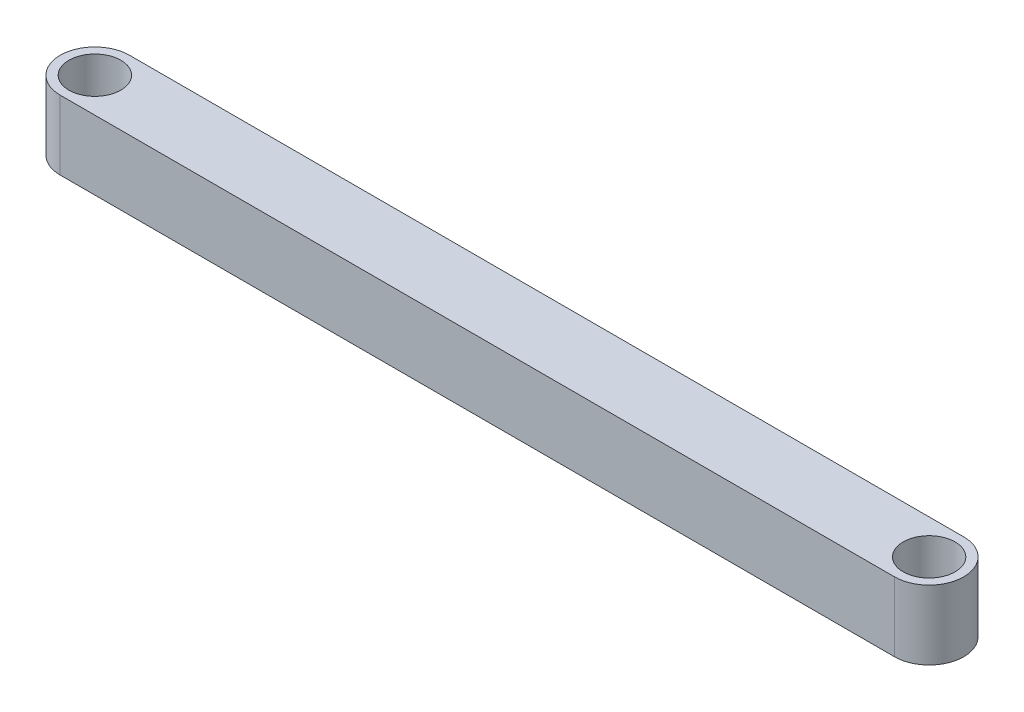
ISO-10303-21;
HEADER;
FILE_DESCRIPTION(('STEP AP214'),'2;1');
FILE_NAME('part.step','',(''),(''),'','','');
FILE_SCHEMA(('AUTOMOTIVE_DESIGN { 1 0 10303 214 1 1 1 1 }'));
ENDSEC;
DATA;
#1=APPLICATION_CONTEXT('core data for automotive mechanical design processes');
#2=APPLICATION_PROTOCOL_DEFINITION('international standard','automotive_design',2000,#1);
#3=PRODUCT_CONTEXT('',#1,'mechanical');
#4=PRODUCT('Part','Part','',(#3));
#5=PRODUCT_RELATED_PRODUCT_CATEGORY('part','',(#4));
#6=PRODUCT_DEFINITION_FORMATION('','',#4);
#7=PRODUCT_DEFINITION_CONTEXT('part definition',#1,'design');
#8=PRODUCT_DEFINITION('design','',#6,#7);
#9=PRODUCT_DEFINITION_SHAPE('','',#8);
#10=(LENGTH_UNIT() NAMED_UNIT(*) SI_UNIT(.MILLI.,.METRE.));
#11=(NAMED_UNIT(*) PLANE_ANGLE_UNIT() SI_UNIT($,.RADIAN.));
#12=(NAMED_UNIT(*) SI_UNIT($,.STERADIAN.) SOLID_ANGLE_UNIT());
#13=UNCERTAINTY_MEASURE_WITH_UNIT(LENGTH_MEASURE(1.E-05),#10,'distance_accuracy_value','');
#14=(GEOMETRIC_REPRESENTATION_CONTEXT(3) GLOBAL_UNCERTAINTY_ASSIGNED_CONTEXT((#13)) GLOBAL_UNIT_ASSIGNED_CONTEXT((#10,
#11,#12)) REPRESENTATION_CONTEXT('',''));
#15=CARTESIAN_POINT('',(0.,0.,0.));
#16=DIRECTION('',(0.,0.,1.));
#17=DIRECTION('',(1.,0.,0.));
#18=AXIS2_PLACEMENT_3D('',#15,#16,#17);
#19=CARTESIAN_POINT('',(0.,40.,0.));
#20=DIRECTION('',(0.,1.,0.));
#21=DIRECTION('',(0.,0.,1.));
#22=AXIS2_PLACEMENT_3D('',#19,#20,#21);
#23=PLANE('',#22);
#24=CARTESIAN_POINT('',(482.,40.,0.));
#25=DIRECTION('',(0.,1.,0.));
#26=DIRECTION('',(0.,0.,1.));
#27=AXIS2_PLACEMENT_3D('',#24,#25,#26);
#28=CIRCLE('',#27,15.);
#29=CARTESIAN_POINT('',(482.,40.,15.));
#30=VERTEX_POINT('',#29);
#31=EDGE_CURVE('E140',#30,#30,#28,.T.);
#32=ORIENTED_EDGE('',*,*,#31,.F.);
#33=EDGE_LOOP('',(#32));
#34=FACE_BOUND('',#33,.T.);
#35=CARTESIAN_POINT('',(0.,40.,0.));
#36=DIRECTION('',(0.,1.,0.));
#37=DIRECTION('',(0.,0.,1.));
#38=AXIS2_PLACEMENT_3D('',#35,#36,#37);
#39=CIRCLE('',#38,20.);
#40=CARTESIAN_POINT('',(0.,40.,-20.));
#41=VERTEX_POINT('',#40);
#42=CARTESIAN_POINT('',(0.,40.,20.));
#43=VERTEX_POINT('',#42);
#44=EDGE_CURVE('E124',#41,#43,#39,.T.);
#45=ORIENTED_EDGE('',*,*,#44,.T.);
#46=DIRECTION('',(1.,0.,0.));
#47=VECTOR('',#46,1.);
#48=CARTESIAN_POINT('',(0.,40.,20.));
#49=LINE('',#48,#47);
#50=CARTESIAN_POINT('',(482.,40.,20.));
#51=VERTEX_POINT('',#50);
#52=EDGE_CURVE('E117',#43,#51,#49,.T.);
#53=ORIENTED_EDGE('',*,*,#52,.T.);
#54=CARTESIAN_POINT('',(482.,40.,0.));
#55=DIRECTION('',(0.,1.,0.));
#56=DIRECTION('',(0.,0.,1.));
#57=AXIS2_PLACEMENT_3D('',#54,#55,#56);
#58=CIRCLE('',#57,20.);
#59=CARTESIAN_POINT('',(482.,40.,-20.));
#60=VERTEX_POINT('',#59);
#61=EDGE_CURVE('E123',#51,#60,#58,.T.);
#62=ORIENTED_EDGE('',*,*,#61,.T.);
#63=DIRECTION('',(1.,0.,0.));
#64=VECTOR('',#63,1.);
#65=CARTESIAN_POINT('',(0.,40.,-20.));
#66=LINE('',#65,#64);
#67=EDGE_CURVE('E133',#41,#60,#66,.T.);
#68=ORIENTED_EDGE('',*,*,#67,.F.);
#69=EDGE_LOOP('',(#45,#53,#62,#68));
#70=FACE_BOUND('',#69,.T.);
#71=CARTESIAN_POINT('',(0.,40.,0.));
#72=DIRECTION('',(0.,1.,0.));
#73=DIRECTION('',(0.,0.,1.));
#74=AXIS2_PLACEMENT_3D('',#71,#72,#73);
#75=CIRCLE('',#74,15.);
#76=CARTESIAN_POINT('',(0.,40.,15.));
#77=VERTEX_POINT('',#76);
#78=EDGE_CURVE('E153',#77,#77,#75,.T.);
#79=ORIENTED_EDGE('',*,*,#78,.F.);
#80=EDGE_LOOP('',(#79));
#81=FACE_BOUND('',#80,.T.);
#82=ADVANCED_FACE('F74',(#34,#70,#81),#23,.T.);
#83=CARTESIAN_POINT('',(0.,0.,0.));
#84=DIRECTION('',(0.,1.,0.));
#85=DIRECTION('',(0.,0.,1.));
#86=AXIS2_PLACEMENT_3D('',#83,#84,#85);
#87=PLANE('',#86);
#88=CARTESIAN_POINT('',(0.,0.,0.));
#89=DIRECTION('',(0.,1.,0.));
#90=DIRECTION('',(0.,0.,1.));
#91=AXIS2_PLACEMENT_3D('',#88,#89,#90);
#92=CIRCLE('',#91,20.);
#93=CARTESIAN_POINT('',(0.,0.,-20.));
#94=VERTEX_POINT('',#93);
#95=CARTESIAN_POINT('',(0.,0.,20.));
#96=VERTEX_POINT('',#95);
#97=EDGE_CURVE('E138',#94,#96,#92,.T.);
#98=ORIENTED_EDGE('',*,*,#97,.F.);
#99=DIRECTION('',(1.,0.,0.));
#100=VECTOR('',#99,1.);
#101=CARTESIAN_POINT('',(0.,0.,-20.));
#102=LINE('',#101,#100);
#103=CARTESIAN_POINT('',(482.,0.,-20.));
#104=VERTEX_POINT('',#103);
#105=EDGE_CURVE('E144',#94,#104,#102,.T.);
#106=ORIENTED_EDGE('',*,*,#105,.T.);
#107=CARTESIAN_POINT('',(482.,0.,0.));
#108=DIRECTION('',(0.,1.,0.));
#109=DIRECTION('',(0.,0.,1.));
#110=AXIS2_PLACEMENT_3D('',#107,#108,#109);
#111=CIRCLE('',#110,20.);
#112=CARTESIAN_POINT('',(482.,0.,20.));
#113=VERTEX_POINT('',#112);
#114=EDGE_CURVE('E142',#113,#104,#111,.T.);
#115=ORIENTED_EDGE('',*,*,#114,.F.);
#116=DIRECTION('',(1.,0.,0.));
#117=VECTOR('',#116,1.);
#118=CARTESIAN_POINT('',(0.,0.,20.));
#119=LINE('',#118,#117);
#120=EDGE_CURVE('E129',#96,#113,#119,.T.);
#121=ORIENTED_EDGE('',*,*,#120,.F.);
#122=EDGE_LOOP('',(#98,#106,#115,#121));
#123=FACE_BOUND('',#122,.T.);
#124=CARTESIAN_POINT('',(482.,0.,0.));
#125=DIRECTION('',(0.,1.,0.));
#126=DIRECTION('',(0.,0.,1.));
#127=AXIS2_PLACEMENT_3D('',#124,#125,#126);
#128=CIRCLE('',#127,15.);
#129=CARTESIAN_POINT('',(482.,0.,15.));
#130=VERTEX_POINT('',#129);
#131=EDGE_CURVE('E150',#130,#130,#128,.T.);
#132=ORIENTED_EDGE('',*,*,#131,.T.);
#133=EDGE_LOOP('',(#132));
#134=FACE_BOUND('',#133,.T.);
#135=CARTESIAN_POINT('',(0.,0.,0.));
#136=DIRECTION('',(0.,1.,0.));
#137=DIRECTION('',(0.,0.,1.));
#138=AXIS2_PLACEMENT_3D('',#135,#136,#137);
#139=CIRCLE('',#138,15.);
#140=CARTESIAN_POINT('',(0.,0.,15.));
#141=VERTEX_POINT('',#140);
#142=EDGE_CURVE('E156',#141,#141,#139,.T.);
#143=ORIENTED_EDGE('',*,*,#142,.T.);
#144=EDGE_LOOP('',(#143));
#145=FACE_BOUND('',#144,.T.);
#146=ADVANCED_FACE('F165',(#123,#134,#145),#87,.F.);
#147=CARTESIAN_POINT('',(0.,40.,0.));
#148=DIRECTION('',(0.,-1.,0.));
#149=DIRECTION('',(0.,0.,-1.));
#150=AXIS2_PLACEMENT_3D('',#147,#148,#149);
#151=CYLINDRICAL_SURFACE('',#150,20.);
#152=ORIENTED_EDGE('',*,*,#97,.T.);
#153=DIRECTION('',(0.,-1.,0.));
#154=VECTOR('',#153,1.);
#155=CARTESIAN_POINT('',(0.,40.,20.));
#156=LINE('',#155,#154);
#157=EDGE_CURVE('E14',#43,#96,#156,.T.);
#158=ORIENTED_EDGE('',*,*,#157,.F.);
#159=ORIENTED_EDGE('',*,*,#44,.F.);
#160=DIRECTION('',(0.,-1.,0.));
#161=VECTOR('',#160,1.);
#162=CARTESIAN_POINT('',(0.,40.,-20.));
#163=LINE('',#162,#161);
#164=EDGE_CURVE('E91',#41,#94,#163,.T.);
#165=ORIENTED_EDGE('',*,*,#164,.T.);
#166=EDGE_LOOP('',(#152,#158,#159,#165));
#167=FACE_BOUND('',#166,.T.);
#168=ADVANCED_FACE('F76',(#167),#151,.T.);
#169=CARTESIAN_POINT('',(0.,40.,20.));
#170=DIRECTION('',(0.,0.,-1.));
#171=DIRECTION('',(-1.,0.,0.));
#172=AXIS2_PLACEMENT_3D('',#169,#170,#171);
#173=PLANE('',#172);
#174=ORIENTED_EDGE('',*,*,#120,.T.);
#175=DIRECTION('',(0.,-1.,0.));
#176=VECTOR('',#175,1.);
#177=CARTESIAN_POINT('',(482.,40.,20.));
#178=LINE('',#177,#176);
#179=EDGE_CURVE('E83',#51,#113,#178,.T.);
#180=ORIENTED_EDGE('',*,*,#179,.F.);
#181=ORIENTED_EDGE('',*,*,#52,.F.);
#182=ORIENTED_EDGE('',*,*,#157,.T.);
#183=EDGE_LOOP('',(#174,#180,#181,#182));
#184=FACE_BOUND('',#183,.T.);
#185=ADVANCED_FACE('F128',(#184),#173,.F.);
#186=CARTESIAN_POINT('',(482.,40.,0.));
#187=DIRECTION('',(0.,-1.,0.));
#188=DIRECTION('',(0.,0.,-1.));
#189=AXIS2_PLACEMENT_3D('',#186,#187,#188);
#190=CYLINDRICAL_SURFACE('',#189,20.);
#191=ORIENTED_EDGE('',*,*,#114,.T.);
#192=DIRECTION('',(0.,-1.,0.));
#193=VECTOR('',#192,1.);
#194=CARTESIAN_POINT('',(482.,40.,-20.));
#195=LINE('',#194,#193);
#196=EDGE_CURVE('E106',#60,#104,#195,.T.);
#197=ORIENTED_EDGE('',*,*,#196,.F.);
#198=ORIENTED_EDGE('',*,*,#61,.F.);
#199=ORIENTED_EDGE('',*,*,#179,.T.);
#200=EDGE_LOOP('',(#191,#197,#198,#199));
#201=FACE_BOUND('',#200,.T.);
#202=ADVANCED_FACE('F132',(#201),#190,.T.);
#203=CARTESIAN_POINT('',(0.,40.,-20.));
#204=DIRECTION('',(0.,0.,-1.));
#205=DIRECTION('',(-1.,0.,0.));
#206=AXIS2_PLACEMENT_3D('',#203,#204,#205);
#207=PLANE('',#206);
#208=ORIENTED_EDGE('',*,*,#105,.F.);
#209=ORIENTED_EDGE('',*,*,#164,.F.);
#210=ORIENTED_EDGE('',*,*,#67,.T.);
#211=ORIENTED_EDGE('',*,*,#196,.T.);
#212=EDGE_LOOP('',(#208,#209,#210,#211));
#213=FACE_BOUND('',#212,.T.);
#214=ADVANCED_FACE('F177',(#213),#207,.T.);
#215=CARTESIAN_POINT('',(482.,40.,0.));
#216=DIRECTION('',(0.,-1.,0.));
#217=DIRECTION('',(0.,0.,-1.));
#218=AXIS2_PLACEMENT_3D('',#215,#216,#217);
#219=CYLINDRICAL_SURFACE('',#218,15.);
#220=ORIENTED_EDGE('',*,*,#31,.T.);
#221=EDGE_LOOP('',(#220));
#222=FACE_BOUND('',#221,.T.);
#223=ORIENTED_EDGE('',*,*,#131,.F.);
#224=EDGE_LOOP('',(#223));
#225=FACE_BOUND('',#224,.T.);
#226=ADVANCED_FACE('F174',(#222,#225),#219,.F.);
#227=CARTESIAN_POINT('',(0.,40.,0.));
#228=DIRECTION('',(0.,-1.,0.));
#229=DIRECTION('',(0.,0.,-1.));
#230=AXIS2_PLACEMENT_3D('',#227,#228,#229);
#231=CYLINDRICAL_SURFACE('',#230,15.);
#232=ORIENTED_EDGE('',*,*,#78,.T.);
#233=EDGE_LOOP('',(#232));
#234=FACE_BOUND('',#233,.T.);
#235=ORIENTED_EDGE('',*,*,#142,.F.);
#236=EDGE_LOOP('',(#235));
#237=FACE_BOUND('',#236,.T.);
#238=ADVANCED_FACE('F162',(#234,#237),#231,.F.);
#239=CLOSED_SHELL('',(#82,#146,#168,#185,#202,#214,#226,#238));
#240=MANIFOLD_SOLID_BREP('B2',#239);
#241=ADVANCED_BREP_SHAPE_REPRESENTATION('',(#18,#240),#14);
#242=SHAPE_DEFINITION_REPRESENTATION(#9,#241);
ENDSEC;
END-ISO-10303-21;
